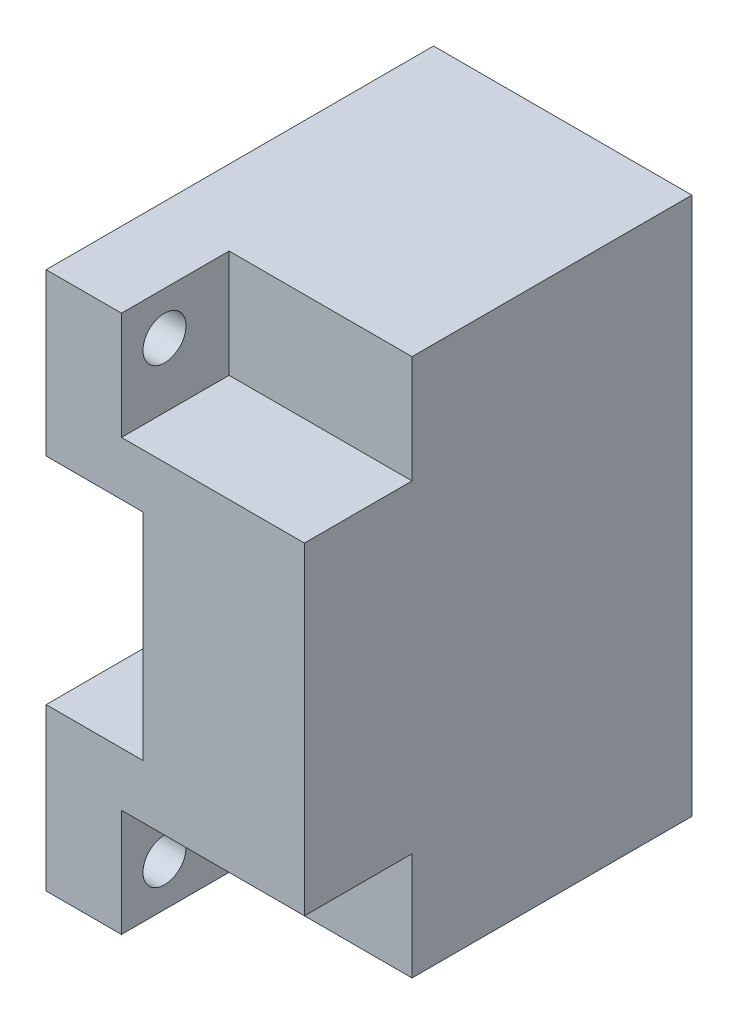
ISO-10303-21;
HEADER;
FILE_DESCRIPTION(('STEP AP214'),'2;1');
FILE_NAME('part.step','',(''),(''),'','','');
FILE_SCHEMA(('AUTOMOTIVE_DESIGN { 1 0 10303 214 1 1 1 1 }'));
ENDSEC;
DATA;
#1=APPLICATION_CONTEXT('core data for automotive mechanical design processes');
#2=APPLICATION_PROTOCOL_DEFINITION('international standard','automotive_design',2000,#1);
#3=PRODUCT_CONTEXT('',#1,'mechanical');
#4=PRODUCT('Part','Part','',(#3));
#5=PRODUCT_RELATED_PRODUCT_CATEGORY('part','',(#4));
#6=PRODUCT_DEFINITION_FORMATION('','',#4);
#7=PRODUCT_DEFINITION_CONTEXT('part definition',#1,'design');
#8=PRODUCT_DEFINITION('design','',#6,#7);
#9=PRODUCT_DEFINITION_SHAPE('','',#8);
#10=(LENGTH_UNIT() NAMED_UNIT(*) SI_UNIT(.MILLI.,.METRE.));
#11=(NAMED_UNIT(*) PLANE_ANGLE_UNIT() SI_UNIT($,.RADIAN.));
#12=(NAMED_UNIT(*) SI_UNIT($,.STERADIAN.) SOLID_ANGLE_UNIT());
#13=UNCERTAINTY_MEASURE_WITH_UNIT(LENGTH_MEASURE(1.E-05),#10,'distance_accuracy_value','');
#14=(GEOMETRIC_REPRESENTATION_CONTEXT(3) GLOBAL_UNCERTAINTY_ASSIGNED_CONTEXT((#13)) GLOBAL_UNIT_ASSIGNED_CONTEXT((#10,
#11,#12)) REPRESENTATION_CONTEXT('',''));
#15=CARTESIAN_POINT('',(0.,0.,0.));
#16=DIRECTION('',(0.,0.,1.));
#17=DIRECTION('',(1.,0.,0.));
#18=AXIS2_PLACEMENT_3D('',#15,#16,#17);
#19=CARTESIAN_POINT('',(-12.5,12.5,10.));
#20=DIRECTION('',(0.,-1.,0.));
#21=DIRECTION('',(0.,0.,-1.));
#22=AXIS2_PLACEMENT_3D('',#19,#20,#21);
#23=PLANE('',#22);
#24=DIRECTION('',(-1.,0.,0.));
#25=VECTOR('',#24,1.);
#26=CARTESIAN_POINT('',(-12.5,12.5,0.));
#27=LINE('',#26,#25);
#28=CARTESIAN_POINT('',(12.5,12.5,0.));
#29=VERTEX_POINT('',#28);
#30=CARTESIAN_POINT('',(0.5,12.5,0.));
#31=VERTEX_POINT('',#30);
#32=EDGE_CURVE('E53',#29,#31,#27,.T.);
#33=ORIENTED_EDGE('',*,*,#32,.T.);
#34=DIRECTION('',(0.,0.,1.));
#35=VECTOR('',#34,1.);
#36=CARTESIAN_POINT('',(0.5,12.5,0.));
#37=LINE('',#36,#35);
#38=CARTESIAN_POINT('',(0.5,12.5,18.));
#39=VERTEX_POINT('',#38);
#40=EDGE_CURVE('E167',#31,#39,#37,.T.);
#41=ORIENTED_EDGE('',*,*,#40,.T.);
#42=DIRECTION('',(-1.,0.,0.));
#43=VECTOR('',#42,1.);
#44=CARTESIAN_POINT('',(12.5,12.5,18.));
#45=LINE('',#44,#43);
#46=CARTESIAN_POINT('',(4.,12.5,18.));
#47=VERTEX_POINT('',#46);
#48=EDGE_CURVE('E203',#47,#39,#45,.T.);
#49=ORIENTED_EDGE('',*,*,#48,.F.);
#50=DIRECTION('',(0.,0.,-1.));
#51=VECTOR('',#50,1.);
#52=CARTESIAN_POINT('',(4.,12.5,18.));
#53=LINE('',#52,#51);
#54=CARTESIAN_POINT('',(4.,12.5,13.));
#55=VERTEX_POINT('',#54);
#56=EDGE_CURVE('E288',#47,#55,#53,.T.);
#57=ORIENTED_EDGE('',*,*,#56,.T.);
#58=DIRECTION('',(-1.,0.,0.));
#59=VECTOR('',#58,1.);
#60=CARTESIAN_POINT('',(12.5,12.5,13.));
#61=LINE('',#60,#59);
#62=CARTESIAN_POINT('',(12.5,12.5,13.));
#63=VERTEX_POINT('',#62);
#64=EDGE_CURVE('E274',#63,#55,#61,.T.);
#65=ORIENTED_EDGE('',*,*,#64,.F.);
#66=DIRECTION('',(0.,0.,-1.));
#67=VECTOR('',#66,1.);
#68=CARTESIAN_POINT('',(12.5,12.5,10.));
#69=LINE('',#68,#67);
#70=EDGE_CURVE('E193',#63,#29,#69,.T.);
#71=ORIENTED_EDGE('',*,*,#70,.T.);
#72=EDGE_LOOP('',(#33,#41,#49,#57,#65,#71));
#73=FACE_BOUND('',#72,.T.);
#74=ADVANCED_FACE('F45',(#73),#23,.F.);
#75=CARTESIAN_POINT('',(0.,0.,18.));
#76=DIRECTION('',(0.,0.,1.));
#77=DIRECTION('',(1.,0.,0.));
#78=AXIS2_PLACEMENT_3D('',#75,#76,#77);
#79=PLANE('',#78);
#80=DIRECTION('',(0.,1.,0.));
#81=VECTOR('',#80,1.);
#82=CARTESIAN_POINT('',(0.5,0.,18.));
#83=LINE('',#82,#81);
#84=CARTESIAN_POINT('',(0.5,-12.5,18.));
#85=VERTEX_POINT('',#84);
#86=CARTESIAN_POINT('',(0.5,-5.,18.));
#87=VERTEX_POINT('',#86);
#88=EDGE_CURVE('E60',#85,#87,#83,.T.);
#89=ORIENTED_EDGE('',*,*,#88,.F.);
#90=DIRECTION('',(1.,0.,0.));
#91=VECTOR('',#90,1.);
#92=CARTESIAN_POINT('',(-12.5,-12.5,18.));
#93=LINE('',#92,#91);
#94=CARTESIAN_POINT('',(4.,-12.5,18.));
#95=VERTEX_POINT('',#94);
#96=EDGE_CURVE('E208',#85,#95,#93,.T.);
#97=ORIENTED_EDGE('',*,*,#96,.T.);
#98=DIRECTION('',(0.,-1.,0.));
#99=VECTOR('',#98,1.);
#100=CARTESIAN_POINT('',(4.,-12.5,18.));
#101=LINE('',#100,#99);
#102=CARTESIAN_POINT('',(4.,-7.5,18.));
#103=VERTEX_POINT('',#102);
#104=EDGE_CURVE('E271',#103,#95,#101,.T.);
#105=ORIENTED_EDGE('',*,*,#104,.F.);
#106=DIRECTION('',(-1.,0.,0.));
#107=VECTOR('',#106,1.);
#108=CARTESIAN_POINT('',(12.5,-7.5,18.));
#109=LINE('',#108,#107);
#110=CARTESIAN_POINT('',(12.5,-7.5,18.));
#111=VERTEX_POINT('',#110);
#112=EDGE_CURVE('E251',#111,#103,#109,.T.);
#113=ORIENTED_EDGE('',*,*,#112,.F.);
#114=DIRECTION('',(0.,-1.,0.));
#115=VECTOR('',#114,1.);
#116=CARTESIAN_POINT('',(12.5,12.5,18.));
#117=LINE('',#116,#115);
#118=CARTESIAN_POINT('',(12.5,7.5,18.));
#119=VERTEX_POINT('',#118);
#120=EDGE_CURVE('E236',#119,#111,#117,.T.);
#121=ORIENTED_EDGE('',*,*,#120,.F.);
#122=DIRECTION('',(-1.,0.,0.));
#123=VECTOR('',#122,1.);
#124=CARTESIAN_POINT('',(12.5,7.5,18.));
#125=LINE('',#124,#123);
#126=CARTESIAN_POINT('',(4.,7.5,18.));
#127=VERTEX_POINT('',#126);
#128=EDGE_CURVE('E279',#119,#127,#125,.T.);
#129=ORIENTED_EDGE('',*,*,#128,.T.);
#130=DIRECTION('',(0.,1.,0.));
#131=VECTOR('',#130,1.);
#132=CARTESIAN_POINT('',(4.,12.5,18.));
#133=LINE('',#132,#131);
#134=EDGE_CURVE('E297',#127,#47,#133,.T.);
#135=ORIENTED_EDGE('',*,*,#134,.T.);
#136=ORIENTED_EDGE('',*,*,#48,.T.);
#137=CARTESIAN_POINT('',(0.5,5.,18.));
#138=VERTEX_POINT('',#137);
#139=EDGE_CURVE('E173',#138,#39,#83,.T.);
#140=ORIENTED_EDGE('',*,*,#139,.F.);
#141=DIRECTION('',(-1.,0.,0.));
#142=VECTOR('',#141,1.);
#143=CARTESIAN_POINT('',(-5.,5.,18.));
#144=LINE('',#143,#142);
#145=CARTESIAN_POINT('',(5.,5.,18.));
#146=VERTEX_POINT('',#145);
#147=EDGE_CURVE('E214',#146,#138,#144,.T.);
#148=ORIENTED_EDGE('',*,*,#147,.F.);
#149=DIRECTION('',(0.,-1.,0.));
#150=VECTOR('',#149,1.);
#151=CARTESIAN_POINT('',(5.,-5.,18.));
#152=LINE('',#151,#150);
#153=CARTESIAN_POINT('',(5.,-5.,18.));
#154=VERTEX_POINT('',#153);
#155=EDGE_CURVE('E248',#146,#154,#152,.T.);
#156=ORIENTED_EDGE('',*,*,#155,.T.);
#157=DIRECTION('',(1.,0.,0.));
#158=VECTOR('',#157,1.);
#159=CARTESIAN_POINT('',(-5.,-5.,18.));
#160=LINE('',#159,#158);
#161=EDGE_CURVE('E211',#87,#154,#160,.T.);
#162=ORIENTED_EDGE('',*,*,#161,.F.);
#163=EDGE_LOOP('',(#89,#97,#105,#113,#121,#129,#135,#136,#140,#148,#156,#162));
#164=FACE_BOUND('',#163,.T.);
#165=ADVANCED_FACE('F342',(#164),#79,.T.);
#166=CARTESIAN_POINT('',(-12.5,-12.5,10.));
#167=DIRECTION('',(0.,1.,0.));
#168=DIRECTION('',(0.,0.,1.));
#169=AXIS2_PLACEMENT_3D('',#166,#167,#168);
#170=PLANE('',#169);
#171=ORIENTED_EDGE('',*,*,#96,.F.);
#172=DIRECTION('',(0.,0.,1.));
#173=VECTOR('',#172,1.);
#174=CARTESIAN_POINT('',(0.5,-12.5,0.));
#175=LINE('',#174,#173);
#176=CARTESIAN_POINT('',(0.5,-12.5,0.));
#177=VERTEX_POINT('',#176);
#178=EDGE_CURVE('E178',#177,#85,#175,.T.);
#179=ORIENTED_EDGE('',*,*,#178,.F.);
#180=DIRECTION('',(1.,0.,0.));
#181=VECTOR('',#180,1.);
#182=CARTESIAN_POINT('',(-12.5,-12.5,0.));
#183=LINE('',#182,#181);
#184=CARTESIAN_POINT('',(12.5,-12.5,0.));
#185=VERTEX_POINT('',#184);
#186=EDGE_CURVE('E12',#177,#185,#183,.T.);
#187=ORIENTED_EDGE('',*,*,#186,.T.);
#188=DIRECTION('',(0.,0.,-1.));
#189=VECTOR('',#188,1.);
#190=CARTESIAN_POINT('',(12.5,-12.5,10.));
#191=LINE('',#190,#189);
#192=CARTESIAN_POINT('',(12.5,-12.5,13.));
#193=VERTEX_POINT('',#192);
#194=EDGE_CURVE('E221',#193,#185,#191,.T.);
#195=ORIENTED_EDGE('',*,*,#194,.F.);
#196=DIRECTION('',(-1.,0.,0.));
#197=VECTOR('',#196,1.);
#198=CARTESIAN_POINT('',(12.5,-12.5,13.));
#199=LINE('',#198,#197);
#200=CARTESIAN_POINT('',(4.,-12.5,13.));
#201=VERTEX_POINT('',#200);
#202=EDGE_CURVE('E254',#193,#201,#199,.T.);
#203=ORIENTED_EDGE('',*,*,#202,.T.);
#204=DIRECTION('',(0.,0.,-1.));
#205=VECTOR('',#204,1.);
#206=CARTESIAN_POINT('',(4.,-12.5,18.));
#207=LINE('',#206,#205);
#208=EDGE_CURVE('E268',#95,#201,#207,.T.);
#209=ORIENTED_EDGE('',*,*,#208,.F.);
#210=EDGE_LOOP('',(#171,#179,#187,#195,#203,#209));
#211=FACE_BOUND('',#210,.T.);
#212=ADVANCED_FACE('F345',(#211),#170,.F.);
#213=CARTESIAN_POINT('',(0.,0.,0.));
#214=DIRECTION('',(0.,0.,-1.));
#215=DIRECTION('',(-1.,0.,0.));
#216=AXIS2_PLACEMENT_3D('',#213,#214,#215);
#217=PLANE('',#216);
#218=DIRECTION('',(0.,-1.,0.));
#219=VECTOR('',#218,1.);
#220=CARTESIAN_POINT('',(0.5,12.5,0.));
#221=LINE('',#220,#219);
#222=CARTESIAN_POINT('',(0.5,4.47213595499958,0.));
#223=VERTEX_POINT('',#222);
#224=EDGE_CURVE('E170',#31,#223,#221,.T.);
#225=ORIENTED_EDGE('',*,*,#224,.F.);
#226=ORIENTED_EDGE('',*,*,#32,.F.);
#227=DIRECTION('',(0.,-1.,0.));
#228=VECTOR('',#227,1.);
#229=CARTESIAN_POINT('',(12.5,-12.5,0.));
#230=LINE('',#229,#228);
#231=EDGE_CURVE('E224',#29,#185,#230,.T.);
#232=ORIENTED_EDGE('',*,*,#231,.T.);
#233=ORIENTED_EDGE('',*,*,#186,.F.);
#234=CARTESIAN_POINT('',(0.5,-4.47213595499958,0.));
#235=VERTEX_POINT('',#234);
#236=EDGE_CURVE('E177',#235,#177,#221,.T.);
#237=ORIENTED_EDGE('',*,*,#236,.F.);
#238=CARTESIAN_POINT('',(0.,0.,0.));
#239=DIRECTION('',(0.,0.,1.));
#240=DIRECTION('',(1.,0.,0.));
#241=AXIS2_PLACEMENT_3D('',#238,#239,#240);
#242=CIRCLE('',#241,4.5);
#243=EDGE_CURVE('E188',#235,#223,#242,.T.);
#244=ORIENTED_EDGE('',*,*,#243,.T.);
#245=EDGE_LOOP('',(#225,#226,#232,#233,#237,#244));
#246=FACE_BOUND('',#245,.T.);
#247=CARTESIAN_POINT('',(4.94974746830588,-4.94974746830578,0.));
#248=DIRECTION('',(0.,0.,-1.));
#249=DIRECTION('',(0.,1.,0.));
#250=AXIS2_PLACEMENT_3D('',#247,#248,#249);
#251=CIRCLE('',#250,2.);
#252=CARTESIAN_POINT('',(4.94974746830586,-2.94974746830578,0.));
#253=VERTEX_POINT('',#252);
#254=EDGE_CURVE('E230',#253,#253,#251,.T.);
#255=ORIENTED_EDGE('',*,*,#254,.F.);
#256=EDGE_LOOP('',(#255));
#257=FACE_BOUND('',#256,.T.);
#258=CARTESIAN_POINT('',(4.94974746830583,4.94974746830583,0.));
#259=DIRECTION('',(0.,0.,-1.));
#260=DIRECTION('',(-1.,0.,0.));
#261=AXIS2_PLACEMENT_3D('',#258,#259,#260);
#262=CIRCLE('',#261,2.);
#263=CARTESIAN_POINT('',(2.94974746830583,4.94974746830583,0.));
#264=VERTEX_POINT('',#263);
#265=EDGE_CURVE('E226',#264,#264,#262,.T.);
#266=ORIENTED_EDGE('',*,*,#265,.F.);
#267=EDGE_LOOP('',(#266));
#268=FACE_BOUND('',#267,.T.);
#269=ADVANCED_FACE('F182',(#246,#257,#268),#217,.T.);
#270=CARTESIAN_POINT('',(0.,0.,3.));
#271=DIRECTION('',(0.,0.,-1.));
#272=DIRECTION('',(-1.,0.,0.));
#273=AXIS2_PLACEMENT_3D('',#270,#271,#272);
#274=PLANE('',#273);
#275=CARTESIAN_POINT('',(0.,0.,3.));
#276=DIRECTION('',(0.,0.,-1.));
#277=DIRECTION('',(-1.,0.,0.));
#278=AXIS2_PLACEMENT_3D('',#275,#276,#277);
#279=CIRCLE('',#278,10.);
#280=CARTESIAN_POINT('',(0.500000000000001,-9.98749217771909,3.));
#281=VERTEX_POINT('',#280);
#282=CARTESIAN_POINT('',(0.500000000000001,9.98749217771909,3.));
#283=VERTEX_POINT('',#282);
#284=EDGE_CURVE('E194',#281,#283,#279,.F.);
#285=ORIENTED_EDGE('',*,*,#284,.T.);
#286=DIRECTION('',(0.,-1.,0.));
#287=VECTOR('',#286,1.);
#288=CARTESIAN_POINT('',(0.5,0.,3.));
#289=LINE('',#288,#287);
#290=CARTESIAN_POINT('',(0.5,4.47213595499958,3.));
#291=VERTEX_POINT('',#290);
#292=EDGE_CURVE('E323',#283,#291,#289,.T.);
#293=ORIENTED_EDGE('',*,*,#292,.T.);
#294=CARTESIAN_POINT('',(0.,0.,3.));
#295=DIRECTION('',(0.,0.,1.));
#296=DIRECTION('',(1.,0.,0.));
#297=AXIS2_PLACEMENT_3D('',#294,#295,#296);
#298=CIRCLE('',#297,4.5);
#299=CARTESIAN_POINT('',(0.5,-4.47213595499958,3.));
#300=VERTEX_POINT('',#299);
#301=EDGE_CURVE('E202',#300,#291,#298,.T.);
#302=ORIENTED_EDGE('',*,*,#301,.F.);
#303=EDGE_CURVE('E316',#300,#281,#289,.T.);
#304=ORIENTED_EDGE('',*,*,#303,.T.);
#305=EDGE_LOOP('',(#285,#293,#302,#304));
#306=FACE_BOUND('',#305,.T.);
#307=CARTESIAN_POINT('',(4.94974746830588,-4.94974746830578,3.));
#308=DIRECTION('',(0.,0.,-1.));
#309=DIRECTION('',(0.,1.,0.));
#310=AXIS2_PLACEMENT_3D('',#307,#308,#309);
#311=CIRCLE('',#310,2.);
#312=CARTESIAN_POINT('',(4.94974746830586,-2.94974746830578,3.));
#313=VERTEX_POINT('',#312);
#314=EDGE_CURVE('E233',#313,#313,#311,.T.);
#315=ORIENTED_EDGE('',*,*,#314,.T.);
#316=EDGE_LOOP('',(#315));
#317=FACE_BOUND('',#316,.T.);
#318=CARTESIAN_POINT('',(4.94974746830583,4.94974746830583,3.));
#319=DIRECTION('',(0.,0.,-1.));
#320=DIRECTION('',(-1.,0.,0.));
#321=AXIS2_PLACEMENT_3D('',#318,#319,#320);
#322=CIRCLE('',#321,2.);
#323=CARTESIAN_POINT('',(2.94974746830583,4.94974746830583,3.));
#324=VERTEX_POINT('',#323);
#325=EDGE_CURVE('E227',#324,#324,#322,.T.);
#326=ORIENTED_EDGE('',*,*,#325,.T.);
#327=EDGE_LOOP('',(#326));
#328=FACE_BOUND('',#327,.T.);
#329=ADVANCED_FACE('F403',(#306,#317,#328),#274,.F.);
#330=CARTESIAN_POINT('',(0.,0.,-28.2842712474619));
#331=DIRECTION('',(0.,0.,1.));
#332=DIRECTION('',(1.,0.,0.));
#333=AXIS2_PLACEMENT_3D('',#330,#331,#332);
#334=CYLINDRICAL_SURFACE('',#333,10.);
#335=CARTESIAN_POINT('',(0.,0.,10.));
#336=DIRECTION('',(0.,0.,1.));
#337=DIRECTION('',(1.,0.,0.));
#338=AXIS2_PLACEMENT_3D('',#335,#336,#337);
#339=CIRCLE('',#338,10.);
#340=CARTESIAN_POINT('',(0.5,-9.98749217771909,10.));
#341=VERTEX_POINT('',#340);
#342=CARTESIAN_POINT('',(0.5,9.98749217771909,10.));
#343=VERTEX_POINT('',#342);
#344=EDGE_CURVE('E199',#341,#343,#339,.T.);
#345=ORIENTED_EDGE('',*,*,#344,.T.);
#346=DIRECTION('',(0.,0.,1.));
#347=VECTOR('',#346,1.);
#348=CARTESIAN_POINT('',(0.500000000000001,9.98749217771909,-28.2842712474619));
#349=LINE('',#348,#347);
#350=EDGE_CURVE('E326',#343,#283,#349,.F.);
#351=ORIENTED_EDGE('',*,*,#350,.T.);
#352=ORIENTED_EDGE('',*,*,#284,.F.);
#353=DIRECTION('',(0.,0.,1.));
#354=VECTOR('',#353,1.);
#355=CARTESIAN_POINT('',(0.500000000000001,-9.98749217771909,-28.2842712474619));
#356=LINE('',#355,#354);
#357=EDGE_CURVE('E313',#281,#341,#356,.T.);
#358=ORIENTED_EDGE('',*,*,#357,.T.);
#359=EDGE_LOOP('',(#345,#351,#352,#358));
#360=FACE_BOUND('',#359,.T.);
#361=ADVANCED_FACE('F399',(#360),#334,.F.);
#362=CARTESIAN_POINT('',(0.,0.,0.));
#363=DIRECTION('',(0.,0.,1.));
#364=DIRECTION('',(1.,0.,0.));
#365=AXIS2_PLACEMENT_3D('',#362,#363,#364);
#366=CYLINDRICAL_SURFACE('',#365,4.5);
#367=ORIENTED_EDGE('',*,*,#301,.T.);
#368=DIRECTION('',(0.,0.,1.));
#369=VECTOR('',#368,1.);
#370=CARTESIAN_POINT('',(0.5,4.47213595499958,0.));
#371=LINE('',#370,#369);
#372=EDGE_CURVE('E320',#291,#223,#371,.F.);
#373=ORIENTED_EDGE('',*,*,#372,.T.);
#374=ORIENTED_EDGE('',*,*,#243,.F.);
#375=DIRECTION('',(0.,0.,1.));
#376=VECTOR('',#375,1.);
#377=CARTESIAN_POINT('',(0.5,-4.47213595499958,0.));
#378=LINE('',#377,#376);
#379=EDGE_CURVE('E310',#235,#300,#378,.T.);
#380=ORIENTED_EDGE('',*,*,#379,.T.);
#381=EDGE_LOOP('',(#367,#373,#374,#380));
#382=FACE_BOUND('',#381,.T.);
#383=ADVANCED_FACE('F395',(#382),#366,.F.);
#384=CARTESIAN_POINT('',(0.,0.,10.));
#385=DIRECTION('',(0.,0.,1.));
#386=DIRECTION('',(1.,0.,0.));
#387=AXIS2_PLACEMENT_3D('',#384,#385,#386);
#388=PLANE('',#387);
#389=ORIENTED_EDGE('',*,*,#344,.F.);
#390=DIRECTION('',(0.,1.,0.));
#391=VECTOR('',#390,1.);
#392=CARTESIAN_POINT('',(0.5,0.,10.));
#393=LINE('',#392,#391);
#394=CARTESIAN_POINT('',(0.5,-5.,10.));
#395=VERTEX_POINT('',#394);
#396=EDGE_CURVE('E317',#341,#395,#393,.T.);
#397=ORIENTED_EDGE('',*,*,#396,.T.);
#398=DIRECTION('',(1.,0.,0.));
#399=VECTOR('',#398,1.);
#400=CARTESIAN_POINT('',(-5.,-5.,10.));
#401=LINE('',#400,#399);
#402=CARTESIAN_POINT('',(5.,-5.,10.));
#403=VERTEX_POINT('',#402);
#404=EDGE_CURVE('E210',#395,#403,#401,.T.);
#405=ORIENTED_EDGE('',*,*,#404,.T.);
#406=DIRECTION('',(0.,-1.,0.));
#407=VECTOR('',#406,1.);
#408=CARTESIAN_POINT('',(5.,-5.,10.));
#409=LINE('',#408,#407);
#410=CARTESIAN_POINT('',(5.,5.,10.));
#411=VERTEX_POINT('',#410);
#412=EDGE_CURVE('E245',#411,#403,#409,.T.);
#413=ORIENTED_EDGE('',*,*,#412,.F.);
#414=DIRECTION('',(-1.,0.,0.));
#415=VECTOR('',#414,1.);
#416=CARTESIAN_POINT('',(-5.,5.,10.));
#417=LINE('',#416,#415);
#418=CARTESIAN_POINT('',(0.5,5.,10.));
#419=VERTEX_POINT('',#418);
#420=EDGE_CURVE('E213',#411,#419,#417,.T.);
#421=ORIENTED_EDGE('',*,*,#420,.T.);
#422=EDGE_CURVE('E68',#419,#343,#393,.T.);
#423=ORIENTED_EDGE('',*,*,#422,.T.);
#424=EDGE_LOOP('',(#389,#397,#405,#413,#421,#423));
#425=FACE_BOUND('',#424,.T.);
#426=ADVANCED_FACE('F391',(#425),#388,.F.);
#427=CARTESIAN_POINT('',(-5.,-5.,10.));
#428=DIRECTION('',(0.,-1.,0.));
#429=DIRECTION('',(0.,0.,-1.));
#430=AXIS2_PLACEMENT_3D('',#427,#428,#429);
#431=PLANE('',#430);
#432=ORIENTED_EDGE('',*,*,#404,.F.);
#433=DIRECTION('',(0.,0.,1.));
#434=VECTOR('',#433,1.);
#435=CARTESIAN_POINT('',(0.5,-5.,10.));
#436=LINE('',#435,#434);
#437=EDGE_CURVE('E318',#395,#87,#436,.T.);
#438=ORIENTED_EDGE('',*,*,#437,.T.);
#439=ORIENTED_EDGE('',*,*,#161,.T.);
#440=DIRECTION('',(0.,0.,1.));
#441=VECTOR('',#440,1.);
#442=CARTESIAN_POINT('',(5.,-5.,10.));
#443=LINE('',#442,#441);
#444=EDGE_CURVE('E241',#403,#154,#443,.T.);
#445=ORIENTED_EDGE('',*,*,#444,.F.);
#446=EDGE_LOOP('',(#432,#438,#439,#445));
#447=FACE_BOUND('',#446,.T.);
#448=ADVANCED_FACE('F394',(#447),#431,.F.);
#449=CARTESIAN_POINT('',(-5.,5.,10.));
#450=DIRECTION('',(0.,1.,0.));
#451=DIRECTION('',(0.,0.,1.));
#452=AXIS2_PLACEMENT_3D('',#449,#450,#451);
#453=PLANE('',#452);
#454=ORIENTED_EDGE('',*,*,#147,.T.);
#455=DIRECTION('',(0.,0.,-1.));
#456=VECTOR('',#455,1.);
#457=CARTESIAN_POINT('',(0.5,5.,10.));
#458=LINE('',#457,#456);
#459=EDGE_CURVE('E330',#138,#419,#458,.T.);
#460=ORIENTED_EDGE('',*,*,#459,.T.);
#461=ORIENTED_EDGE('',*,*,#420,.F.);
#462=DIRECTION('',(0.,0.,1.));
#463=VECTOR('',#462,1.);
#464=CARTESIAN_POINT('',(5.,5.,10.));
#465=LINE('',#464,#463);
#466=EDGE_CURVE('E242',#411,#146,#465,.T.);
#467=ORIENTED_EDGE('',*,*,#466,.T.);
#468=EDGE_LOOP('',(#454,#460,#461,#467));
#469=FACE_BOUND('',#468,.T.);
#470=ADVANCED_FACE('F389',(#469),#453,.F.);
#471=CARTESIAN_POINT('',(0.,-10.5,16.));
#472=DIRECTION('',(-1.,0.,0.));
#473=DIRECTION('',(0.,0.,1.));
#474=AXIS2_PLACEMENT_3D('',#471,#472,#473);
#475=CYLINDRICAL_SURFACE('',#474,1.);
#476=CARTESIAN_POINT('',(0.5,-10.5,16.));
#477=DIRECTION('',(1.,0.,0.));
#478=DIRECTION('',(0.,0.,-1.));
#479=AXIS2_PLACEMENT_3D('',#476,#477,#478);
#480=CIRCLE('',#479,1.);
#481=CARTESIAN_POINT('',(0.5,-10.5,15.));
#482=VERTEX_POINT('',#481);
#483=EDGE_CURVE('E332',#482,#482,#480,.F.);
#484=ORIENTED_EDGE('',*,*,#483,.T.);
#485=EDGE_LOOP('',(#484));
#486=FACE_BOUND('',#485,.T.);
#487=CARTESIAN_POINT('',(4.,-10.5,16.));
#488=DIRECTION('',(-1.,0.,0.));
#489=DIRECTION('',(0.,0.,1.));
#490=AXIS2_PLACEMENT_3D('',#487,#488,#489);
#491=CIRCLE('',#490,1.);
#492=CARTESIAN_POINT('',(4.,-10.5,17.));
#493=VERTEX_POINT('',#492);
#494=EDGE_CURVE('E300',#493,#493,#491,.T.);
#495=ORIENTED_EDGE('',*,*,#494,.F.);
#496=EDGE_LOOP('',(#495));
#497=FACE_BOUND('',#496,.T.);
#498=ADVANCED_FACE('F441',(#486,#497),#475,.F.);
#499=CARTESIAN_POINT('',(0.,10.5,16.));
#500=DIRECTION('',(-1.,0.,0.));
#501=DIRECTION('',(0.,0.,1.));
#502=AXIS2_PLACEMENT_3D('',#499,#500,#501);
#503=CYLINDRICAL_SURFACE('',#502,1.);
#504=CARTESIAN_POINT('',(0.5,10.5,16.));
#505=DIRECTION('',(1.,0.,0.));
#506=DIRECTION('',(0.,0.,-1.));
#507=AXIS2_PLACEMENT_3D('',#504,#505,#506);
#508=CIRCLE('',#507,1.);
#509=CARTESIAN_POINT('',(0.5,10.5,15.));
#510=VERTEX_POINT('',#509);
#511=EDGE_CURVE('E48',#510,#510,#508,.T.);
#512=ORIENTED_EDGE('',*,*,#511,.F.);
#513=EDGE_LOOP('',(#512));
#514=FACE_BOUND('',#513,.T.);
#515=CARTESIAN_POINT('',(4.,10.5,16.));
#516=DIRECTION('',(1.,0.,0.));
#517=DIRECTION('',(0.,0.,1.));
#518=AXIS2_PLACEMENT_3D('',#515,#516,#517);
#519=CIRCLE('',#518,1.);
#520=CARTESIAN_POINT('',(4.,10.5,17.));
#521=VERTEX_POINT('',#520);
#522=EDGE_CURVE('E307',#521,#521,#519,.T.);
#523=ORIENTED_EDGE('',*,*,#522,.T.);
#524=EDGE_LOOP('',(#523));
#525=FACE_BOUND('',#524,.T.);
#526=ADVANCED_FACE('F448',(#514,#525),#503,.F.);
#527=CARTESIAN_POINT('',(12.5,-12.5,10.));
#528=DIRECTION('',(-1.,0.,0.));
#529=DIRECTION('',(0.,0.,-1.));
#530=AXIS2_PLACEMENT_3D('',#527,#528,#529);
#531=PLANE('',#530);
#532=DIRECTION('',(0.,-1.,0.));
#533=VECTOR('',#532,1.);
#534=CARTESIAN_POINT('',(12.5,12.5,13.));
#535=LINE('',#534,#533);
#536=CARTESIAN_POINT('',(12.5,7.5,13.));
#537=VERTEX_POINT('',#536);
#538=EDGE_CURVE('E283',#63,#537,#535,.T.);
#539=ORIENTED_EDGE('',*,*,#538,.T.);
#540=DIRECTION('',(0.,0.,1.));
#541=VECTOR('',#540,1.);
#542=CARTESIAN_POINT('',(12.5,7.5,18.));
#543=LINE('',#542,#541);
#544=EDGE_CURVE('E291',#537,#119,#543,.T.);
#545=ORIENTED_EDGE('',*,*,#544,.T.);
#546=ORIENTED_EDGE('',*,*,#120,.T.);
#547=DIRECTION('',(0.,0.,1.));
#548=VECTOR('',#547,1.);
#549=CARTESIAN_POINT('',(12.5,-7.5,18.));
#550=LINE('',#549,#548);
#551=CARTESIAN_POINT('',(12.5,-7.5,13.));
#552=VERTEX_POINT('',#551);
#553=EDGE_CURVE('E258',#552,#111,#550,.T.);
#554=ORIENTED_EDGE('',*,*,#553,.F.);
#555=DIRECTION('',(0.,1.,0.));
#556=VECTOR('',#555,1.);
#557=CARTESIAN_POINT('',(12.5,-12.5,13.));
#558=LINE('',#557,#556);
#559=EDGE_CURVE('E265',#193,#552,#558,.T.);
#560=ORIENTED_EDGE('',*,*,#559,.F.);
#561=ORIENTED_EDGE('',*,*,#194,.T.);
#562=ORIENTED_EDGE('',*,*,#231,.F.);
#563=ORIENTED_EDGE('',*,*,#70,.F.);
#564=EDGE_LOOP('',(#539,#545,#546,#554,#560,#561,#562,#563));
#565=FACE_BOUND('',#564,.T.);
#566=ADVANCED_FACE('F356',(#565),#531,.F.);
#567=CARTESIAN_POINT('',(4.94974746830583,4.94974746830583,0.));
#568=DIRECTION('',(0.,0.,1.));
#569=DIRECTION('',(-1.,0.,0.));
#570=AXIS2_PLACEMENT_3D('',#567,#568,#569);
#571=CYLINDRICAL_SURFACE('',#570,2.);
#572=ORIENTED_EDGE('',*,*,#265,.T.);
#573=EDGE_LOOP('',(#572));
#574=FACE_BOUND('',#573,.T.);
#575=ORIENTED_EDGE('',*,*,#325,.F.);
#576=EDGE_LOOP('',(#575));
#577=FACE_BOUND('',#576,.T.);
#578=ADVANCED_FACE('F464',(#574,#577),#571,.F.);
#579=CARTESIAN_POINT('',(4.94974746830588,-4.94974746830578,0.));
#580=DIRECTION('',(0.,0.,1.));
#581=DIRECTION('',(-1.,0.,0.));
#582=AXIS2_PLACEMENT_3D('',#579,#580,#581);
#583=CYLINDRICAL_SURFACE('',#582,2.);
#584=ORIENTED_EDGE('',*,*,#254,.T.);
#585=EDGE_LOOP('',(#584));
#586=FACE_BOUND('',#585,.T.);
#587=ORIENTED_EDGE('',*,*,#314,.F.);
#588=EDGE_LOOP('',(#587));
#589=FACE_BOUND('',#588,.T.);
#590=ADVANCED_FACE('F471',(#586,#589),#583,.F.);
#591=CARTESIAN_POINT('',(5.,-5.,10.));
#592=DIRECTION('',(1.,0.,0.));
#593=DIRECTION('',(0.,0.,1.));
#594=AXIS2_PLACEMENT_3D('',#591,#592,#593);
#595=PLANE('',#594);
#596=ORIENTED_EDGE('',*,*,#155,.F.);
#597=ORIENTED_EDGE('',*,*,#466,.F.);
#598=ORIENTED_EDGE('',*,*,#412,.T.);
#599=ORIENTED_EDGE('',*,*,#444,.T.);
#600=EDGE_LOOP('',(#596,#597,#598,#599));
#601=FACE_BOUND('',#600,.T.);
#602=ADVANCED_FACE('F376',(#601),#595,.F.);
#603=CARTESIAN_POINT('',(12.5,-7.5,18.));
#604=DIRECTION('',(0.,1.,0.));
#605=DIRECTION('',(0.,0.,1.));
#606=AXIS2_PLACEMENT_3D('',#603,#604,#605);
#607=PLANE('',#606);
#608=DIRECTION('',(0.,0.,1.));
#609=VECTOR('',#608,1.);
#610=CARTESIAN_POINT('',(4.,-7.5,18.));
#611=LINE('',#610,#609);
#612=CARTESIAN_POINT('',(4.,-7.5,13.));
#613=VERTEX_POINT('',#612);
#614=EDGE_CURVE('E263',#613,#103,#611,.T.);
#615=ORIENTED_EDGE('',*,*,#614,.F.);
#616=DIRECTION('',(-1.,0.,0.));
#617=VECTOR('',#616,1.);
#618=CARTESIAN_POINT('',(12.5,-7.5,13.));
#619=LINE('',#618,#617);
#620=EDGE_CURVE('E257',#552,#613,#619,.T.);
#621=ORIENTED_EDGE('',*,*,#620,.F.);
#622=ORIENTED_EDGE('',*,*,#553,.T.);
#623=ORIENTED_EDGE('',*,*,#112,.T.);
#624=EDGE_LOOP('',(#615,#621,#622,#623));
#625=FACE_BOUND('',#624,.T.);
#626=ADVANCED_FACE('F353',(#625),#607,.F.);
#627=CARTESIAN_POINT('',(12.5,-12.5,13.));
#628=DIRECTION('',(0.,0.,-1.));
#629=DIRECTION('',(1.,0.,0.));
#630=AXIS2_PLACEMENT_3D('',#627,#628,#629);
#631=PLANE('',#630);
#632=DIRECTION('',(0.,1.,0.));
#633=VECTOR('',#632,1.);
#634=CARTESIAN_POINT('',(4.,-12.5,13.));
#635=LINE('',#634,#633);
#636=EDGE_CURVE('E266',#201,#613,#635,.T.);
#637=ORIENTED_EDGE('',*,*,#636,.F.);
#638=ORIENTED_EDGE('',*,*,#202,.F.);
#639=ORIENTED_EDGE('',*,*,#559,.T.);
#640=ORIENTED_EDGE('',*,*,#620,.T.);
#641=EDGE_LOOP('',(#637,#638,#639,#640));
#642=FACE_BOUND('',#641,.T.);
#643=ADVANCED_FACE('F367',(#642),#631,.F.);
#644=CARTESIAN_POINT('',(4.,0.,0.));
#645=DIRECTION('',(1.,0.,0.));
#646=DIRECTION('',(0.,0.,1.));
#647=AXIS2_PLACEMENT_3D('',#644,#645,#646);
#648=PLANE('',#647);
#649=ORIENTED_EDGE('',*,*,#494,.T.);
#650=EDGE_LOOP('',(#649));
#651=FACE_BOUND('',#650,.T.);
#652=ORIENTED_EDGE('',*,*,#104,.T.);
#653=ORIENTED_EDGE('',*,*,#208,.T.);
#654=ORIENTED_EDGE('',*,*,#636,.T.);
#655=ORIENTED_EDGE('',*,*,#614,.T.);
#656=EDGE_LOOP('',(#652,#653,#654,#655));
#657=FACE_BOUND('',#656,.T.);
#658=ADVANCED_FACE('F348',(#651,#657),#648,.T.);
#659=CARTESIAN_POINT('',(12.5,12.5,13.));
#660=DIRECTION('',(0.,0.,1.));
#661=DIRECTION('',(-1.,0.,0.));
#662=AXIS2_PLACEMENT_3D('',#659,#660,#661);
#663=PLANE('',#662);
#664=DIRECTION('',(0.,-1.,0.));
#665=VECTOR('',#664,1.);
#666=CARTESIAN_POINT('',(4.,12.5,13.));
#667=LINE('',#666,#665);
#668=CARTESIAN_POINT('',(4.,7.5,13.));
#669=VERTEX_POINT('',#668);
#670=EDGE_CURVE('E292',#55,#669,#667,.T.);
#671=ORIENTED_EDGE('',*,*,#670,.T.);
#672=DIRECTION('',(-1.,0.,0.));
#673=VECTOR('',#672,1.);
#674=CARTESIAN_POINT('',(12.5,7.5,13.));
#675=LINE('',#674,#673);
#676=EDGE_CURVE('E282',#537,#669,#675,.T.);
#677=ORIENTED_EDGE('',*,*,#676,.F.);
#678=ORIENTED_EDGE('',*,*,#538,.F.);
#679=ORIENTED_EDGE('',*,*,#64,.T.);
#680=EDGE_LOOP('',(#671,#677,#678,#679));
#681=FACE_BOUND('',#680,.T.);
#682=ADVANCED_FACE('F365',(#681),#663,.T.);
#683=CARTESIAN_POINT('',(12.5,7.5,18.));
#684=DIRECTION('',(0.,1.,0.));
#685=DIRECTION('',(0.,0.,1.));
#686=AXIS2_PLACEMENT_3D('',#683,#684,#685);
#687=PLANE('',#686);
#688=DIRECTION('',(0.,0.,1.));
#689=VECTOR('',#688,1.);
#690=CARTESIAN_POINT('',(4.,7.5,18.));
#691=LINE('',#690,#689);
#692=EDGE_CURVE('E295',#669,#127,#691,.T.);
#693=ORIENTED_EDGE('',*,*,#692,.T.);
#694=ORIENTED_EDGE('',*,*,#128,.F.);
#695=ORIENTED_EDGE('',*,*,#544,.F.);
#696=ORIENTED_EDGE('',*,*,#676,.T.);
#697=EDGE_LOOP('',(#693,#694,#695,#696));
#698=FACE_BOUND('',#697,.T.);
#699=ADVANCED_FACE('F359',(#698),#687,.T.);
#700=CARTESIAN_POINT('',(4.,0.,0.));
#701=DIRECTION('',(1.,0.,0.));
#702=DIRECTION('',(0.,0.,1.));
#703=AXIS2_PLACEMENT_3D('',#700,#701,#702);
#704=PLANE('',#703);
#705=ORIENTED_EDGE('',*,*,#522,.F.);
#706=EDGE_LOOP('',(#705));
#707=FACE_BOUND('',#706,.T.);
#708=ORIENTED_EDGE('',*,*,#134,.F.);
#709=ORIENTED_EDGE('',*,*,#692,.F.);
#710=ORIENTED_EDGE('',*,*,#670,.F.);
#711=ORIENTED_EDGE('',*,*,#56,.F.);
#712=EDGE_LOOP('',(#708,#709,#710,#711));
#713=FACE_BOUND('',#712,.T.);
#714=ADVANCED_FACE('F363',(#707,#713),#704,.T.);
#715=CARTESIAN_POINT('',(0.5,12.5,0.));
#716=DIRECTION('',(1.,0.,0.));
#717=DIRECTION('',(0.,0.,-1.));
#718=AXIS2_PLACEMENT_3D('',#715,#716,#717);
#719=PLANE('',#718);
#720=ORIENTED_EDGE('',*,*,#511,.T.);
#721=EDGE_LOOP('',(#720));
#722=FACE_BOUND('',#721,.T.);
#723=ORIENTED_EDGE('',*,*,#292,.F.);
#724=ORIENTED_EDGE('',*,*,#350,.F.);
#725=ORIENTED_EDGE('',*,*,#422,.F.);
#726=ORIENTED_EDGE('',*,*,#459,.F.);
#727=ORIENTED_EDGE('',*,*,#139,.T.);
#728=ORIENTED_EDGE('',*,*,#40,.F.);
#729=ORIENTED_EDGE('',*,*,#224,.T.);
#730=ORIENTED_EDGE('',*,*,#372,.F.);
#731=EDGE_LOOP('',(#723,#724,#725,#726,#727,#728,#729,#730));
#732=FACE_BOUND('',#731,.T.);
#733=ADVANCED_FACE('F169',(#722,#732),#719,.F.);
#734=ORIENTED_EDGE('',*,*,#483,.F.);
#735=EDGE_LOOP('',(#734));
#736=FACE_BOUND('',#735,.T.);
#737=ORIENTED_EDGE('',*,*,#236,.T.);
#738=ORIENTED_EDGE('',*,*,#178,.T.);
#739=ORIENTED_EDGE('',*,*,#88,.T.);
#740=ORIENTED_EDGE('',*,*,#437,.F.);
#741=ORIENTED_EDGE('',*,*,#396,.F.);
#742=ORIENTED_EDGE('',*,*,#357,.F.);
#743=ORIENTED_EDGE('',*,*,#303,.F.);
#744=ORIENTED_EDGE('',*,*,#379,.F.);
#745=EDGE_LOOP('',(#737,#738,#739,#740,#741,#742,#743,#744));
#746=FACE_BOUND('',#745,.T.);
#747=ADVANCED_FACE('F336',(#736,#746),#719,.F.);
#748=CLOSED_SHELL('',(#74,#165,#212,#269,#329,#361,#383,#426,#448,#470,#498,#526,#566,#578,#590,
#602,#626,#643,#658,#682,#699,#714,#733,#747));
#749=MANIFOLD_SOLID_BREP('B2',#748);
#750=ADVANCED_BREP_SHAPE_REPRESENTATION('',(#18,#749),#14);
#751=SHAPE_DEFINITION_REPRESENTATION(#9,#750);
ENDSEC;
END-ISO-10303-21;
